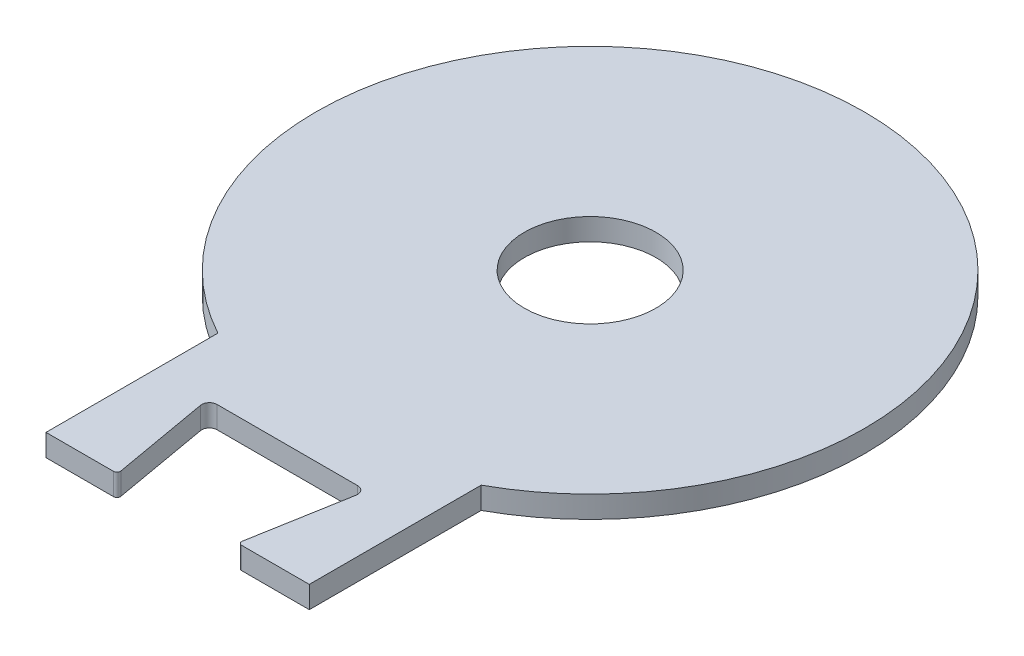
ISO-10303-21;
HEADER;
FILE_DESCRIPTION(('STEP AP214'),'2;1');
FILE_NAME('part.step','',(''),(''),'','','');
FILE_SCHEMA(('AUTOMOTIVE_DESIGN { 1 0 10303 214 1 1 1 1 }'));
ENDSEC;
DATA;
#1=APPLICATION_CONTEXT('core data for automotive mechanical design processes');
#2=APPLICATION_PROTOCOL_DEFINITION('international standard','automotive_design',2000,#1);
#3=PRODUCT_CONTEXT('',#1,'mechanical');
#4=PRODUCT('Part','Part','',(#3));
#5=PRODUCT_RELATED_PRODUCT_CATEGORY('part','',(#4));
#6=PRODUCT_DEFINITION_FORMATION('','',#4);
#7=PRODUCT_DEFINITION_CONTEXT('part definition',#1,'design');
#8=PRODUCT_DEFINITION('design','',#6,#7);
#9=PRODUCT_DEFINITION_SHAPE('','',#8);
#10=(LENGTH_UNIT() NAMED_UNIT(*) SI_UNIT(.MILLI.,.METRE.));
#11=(NAMED_UNIT(*) PLANE_ANGLE_UNIT() SI_UNIT($,.RADIAN.));
#12=(NAMED_UNIT(*) SI_UNIT($,.STERADIAN.) SOLID_ANGLE_UNIT());
#13=UNCERTAINTY_MEASURE_WITH_UNIT(LENGTH_MEASURE(1.E-05),#10,'distance_accuracy_value','');
#14=(GEOMETRIC_REPRESENTATION_CONTEXT(3) GLOBAL_UNCERTAINTY_ASSIGNED_CONTEXT((#13)) GLOBAL_UNIT_ASSIGNED_CONTEXT((#10,
#11,#12)) REPRESENTATION_CONTEXT('',''));
#15=CARTESIAN_POINT('',(0.,0.,0.));
#16=DIRECTION('',(0.,0.,1.));
#17=DIRECTION('',(1.,0.,0.));
#18=AXIS2_PLACEMENT_3D('',#15,#16,#17);
#19=CARTESIAN_POINT('',(-6.,1.,13.2915026221292));
#20=DIRECTION('',(1.,0.,0.));
#21=DIRECTION('',(0.,0.,-1.));
#22=AXIS2_PLACEMENT_3D('',#19,#20,#21);
#23=PLANE('',#22);
#24=DIRECTION('',(0.,0.,1.));
#25=VECTOR('',#24,1.);
#26=CARTESIAN_POINT('',(-6.,0.,13.2915026221292));
#27=LINE('',#26,#25);
#28=CARTESIAN_POINT('',(-6.,0.,10.9658560997307));
#29=VERTEX_POINT('',#28);
#30=CARTESIAN_POINT('',(-6.,0.,18.8));
#31=VERTEX_POINT('',#30);
#32=EDGE_CURVE('E169',#29,#31,#27,.T.);
#33=ORIENTED_EDGE('',*,*,#32,.T.);
#34=DIRECTION('',(0.,1.,0.));
#35=VECTOR('',#34,1.);
#36=CARTESIAN_POINT('',(-6.,-3.,18.8));
#37=LINE('',#36,#35);
#38=CARTESIAN_POINT('',(-6.,1.,18.8));
#39=VERTEX_POINT('',#38);
#40=EDGE_CURVE('E145',#31,#39,#37,.T.);
#41=ORIENTED_EDGE('',*,*,#40,.T.);
#42=DIRECTION('',(0.,0.,1.));
#43=VECTOR('',#42,1.);
#44=CARTESIAN_POINT('',(-6.,1.,-6.));
#45=LINE('',#44,#43);
#46=CARTESIAN_POINT('',(-6.,1.,10.9658560997307));
#47=VERTEX_POINT('',#46);
#48=EDGE_CURVE('E185',#47,#39,#45,.T.);
#49=ORIENTED_EDGE('',*,*,#48,.F.);
#50=DIRECTION('',(0.,-1.,0.));
#51=VECTOR('',#50,1.);
#52=CARTESIAN_POINT('',(-6.,1.,10.9658560997307));
#53=LINE('',#52,#51);
#54=EDGE_CURVE('E249',#29,#47,#53,.F.);
#55=ORIENTED_EDGE('',*,*,#54,.F.);
#56=EDGE_LOOP('',(#33,#41,#49,#55));
#57=FACE_BOUND('',#56,.T.);
#58=ADVANCED_FACE('F39',(#57),#23,.F.);
#59=CARTESIAN_POINT('',(6.,1.,13.2915026221292));
#60=DIRECTION('',(-1.,0.,0.));
#61=DIRECTION('',(0.,0.,1.));
#62=AXIS2_PLACEMENT_3D('',#59,#60,#61);
#63=PLANE('',#62);
#64=DIRECTION('',(0.,0.,-1.));
#65=VECTOR('',#64,1.);
#66=CARTESIAN_POINT('',(6.,1.,19.));
#67=LINE('',#66,#65);
#68=CARTESIAN_POINT('',(6.,1.,18.8));
#69=VERTEX_POINT('',#68);
#70=CARTESIAN_POINT('',(6.,1.,10.9658560997307));
#71=VERTEX_POINT('',#70);
#72=EDGE_CURVE('E152',#69,#71,#67,.T.);
#73=ORIENTED_EDGE('',*,*,#72,.F.);
#74=DIRECTION('',(0.,1.,0.));
#75=VECTOR('',#74,1.);
#76=CARTESIAN_POINT('',(6.,-3.,18.8));
#77=LINE('',#76,#75);
#78=CARTESIAN_POINT('',(6.,0.,18.8));
#79=VERTEX_POINT('',#78);
#80=EDGE_CURVE('E135',#79,#69,#77,.T.);
#81=ORIENTED_EDGE('',*,*,#80,.F.);
#82=DIRECTION('',(0.,0.,-1.));
#83=VECTOR('',#82,1.);
#84=CARTESIAN_POINT('',(6.,0.,13.2915026221292));
#85=LINE('',#84,#83);
#86=CARTESIAN_POINT('',(6.,0.,10.9658560997307));
#87=VERTEX_POINT('',#86);
#88=EDGE_CURVE('E184',#79,#87,#85,.T.);
#89=ORIENTED_EDGE('',*,*,#88,.T.);
#90=DIRECTION('',(0.,-1.,0.));
#91=VECTOR('',#90,1.);
#92=CARTESIAN_POINT('',(6.,1.,10.9658560997307));
#93=LINE('',#92,#91);
#94=EDGE_CURVE('E159',#71,#87,#93,.T.);
#95=ORIENTED_EDGE('',*,*,#94,.F.);
#96=EDGE_LOOP('',(#73,#81,#89,#95));
#97=FACE_BOUND('',#96,.T.);
#98=ADVANCED_FACE('F157',(#97),#63,.F.);
#99=CARTESIAN_POINT('',(0.,1.,0.));
#100=DIRECTION('',(0.,1.,0.));
#101=DIRECTION('',(0.,0.,1.));
#102=AXIS2_PLACEMENT_3D('',#99,#100,#101);
#103=PLANE('',#102);
#104=DIRECTION('',(-0.173648177666934,0.,0.984807753012207));
#105=VECTOR('',#104,1.);
#106=CARTESIAN_POINT('',(2.70227505957538,1.,19.));
#107=LINE('',#106,#105);
#108=CARTESIAN_POINT('',(3.54674431540572,1.,14.2107768621834));
#109=VERTEX_POINT('',#108);
#110=CARTESIAN_POINT('',(2.76858233165438,1.,18.62395277335));
#111=VERTEX_POINT('',#110);
#112=EDGE_CURVE('E161',#109,#111,#107,.T.);
#113=ORIENTED_EDGE('',*,*,#112,.T.);
#114=CARTESIAN_POINT('',(2.91630349460621,1.,18.65));
#115=DIRECTION('',(0.,1.,0.));
#116=DIRECTION('',(0.,0.,1.));
#117=AXIS2_PLACEMENT_3D('',#114,#115,#116);
#118=CIRCLE('',#117,0.15);
#119=CARTESIAN_POINT('',(2.91630349460621,1.,18.8));
#120=VERTEX_POINT('',#119);
#121=EDGE_CURVE('E154',#111,#120,#118,.T.);
#122=ORIENTED_EDGE('',*,*,#121,.T.);
#123=DIRECTION('',(-1.,0.,0.));
#124=VECTOR('',#123,1.);
#125=CARTESIAN_POINT('',(-6.,1.,18.8));
#126=LINE('',#125,#124);
#127=EDGE_CURVE('E138',#69,#120,#126,.T.);
#128=ORIENTED_EDGE('',*,*,#127,.F.);
#129=ORIENTED_EDGE('',*,*,#72,.T.);
#130=CARTESIAN_POINT('',(0.,1.,0.));
#131=DIRECTION('',(0.,1.,0.));
#132=DIRECTION('',(0.,0.,1.));
#133=AXIS2_PLACEMENT_3D('',#130,#131,#132);
#134=CIRCLE('',#133,12.5);
#135=EDGE_CURVE('E255',#71,#47,#134,.T.);
#136=ORIENTED_EDGE('',*,*,#135,.T.);
#137=ORIENTED_EDGE('',*,*,#48,.T.);
#138=CARTESIAN_POINT('',(-2.91630349460621,1.,18.8));
#139=VERTEX_POINT('',#138);
#140=EDGE_CURVE('E155',#139,#39,#126,.T.);
#141=ORIENTED_EDGE('',*,*,#140,.F.);
#142=CARTESIAN_POINT('',(-2.91630349460621,1.,18.65));
#143=DIRECTION('',(0.,1.,0.));
#144=DIRECTION('',(0.,0.,1.));
#145=AXIS2_PLACEMENT_3D('',#142,#143,#144);
#146=CIRCLE('',#145,0.15);
#147=CARTESIAN_POINT('',(-2.76858233165438,1.,18.62395277335));
#148=VERTEX_POINT('',#147);
#149=EDGE_CURVE('E213',#139,#148,#146,.T.);
#150=ORIENTED_EDGE('',*,*,#149,.T.);
#151=DIRECTION('',(-0.173648177666935,0.,-0.984807753012207));
#152=VECTOR('',#151,1.);
#153=CARTESIAN_POINT('',(-2.70227505957538,1.,19.));
#154=LINE('',#153,#152);
#155=CARTESIAN_POINT('',(-3.54674431540572,1.,14.2107768621834));
#156=VERTEX_POINT('',#155);
#157=EDGE_CURVE('E223',#148,#156,#154,.T.);
#158=ORIENTED_EDGE('',*,*,#157,.T.);
#159=CARTESIAN_POINT('',(-3.20206160185145,1.,14.15));
#160=DIRECTION('',(0.,1.,0.));
#161=DIRECTION('',(0.,0.,1.));
#162=AXIS2_PLACEMENT_3D('',#159,#160,#161);
#163=CIRCLE('',#162,0.35);
#164=CARTESIAN_POINT('',(-3.20206160185145,1.,13.8));
#165=VERTEX_POINT('',#164);
#166=EDGE_CURVE('E207',#156,#165,#163,.F.);
#167=ORIENTED_EDGE('',*,*,#166,.T.);
#168=DIRECTION('',(1.,0.,0.));
#169=VECTOR('',#168,1.);
#170=CARTESIAN_POINT('',(-3.61917535925942,1.,13.8));
#171=LINE('',#170,#169);
#172=CARTESIAN_POINT('',(3.20206160185144,1.,13.8));
#173=VERTEX_POINT('',#172);
#174=EDGE_CURVE('E165',#165,#173,#171,.T.);
#175=ORIENTED_EDGE('',*,*,#174,.T.);
#176=CARTESIAN_POINT('',(3.20206160185145,1.,14.15));
#177=DIRECTION('',(0.,1.,0.));
#178=DIRECTION('',(0.,0.,1.));
#179=AXIS2_PLACEMENT_3D('',#176,#177,#178);
#180=CIRCLE('',#179,0.35);
#181=EDGE_CURVE('E201',#173,#109,#180,.F.);
#182=ORIENTED_EDGE('',*,*,#181,.T.);
#183=EDGE_LOOP('',(#113,#122,#128,#129,#136,#137,#141,#150,#158,#167,#175,#182));
#184=FACE_BOUND('',#183,.T.);
#185=CARTESIAN_POINT('',(0.,1.,0.));
#186=DIRECTION('',(0.,1.,0.));
#187=DIRECTION('',(0.,0.,1.));
#188=AXIS2_PLACEMENT_3D('',#185,#186,#187);
#189=CIRCLE('',#188,3.);
#190=CARTESIAN_POINT('',(0.,1.,3.));
#191=VERTEX_POINT('',#190);
#192=EDGE_CURVE('E174',#191,#191,#189,.T.);
#193=ORIENTED_EDGE('',*,*,#192,.F.);
#194=EDGE_LOOP('',(#193));
#195=FACE_BOUND('',#194,.T.);
#196=ADVANCED_FACE('F149',(#184,#195),#103,.T.);
#197=CARTESIAN_POINT('',(0.,0.,0.));
#198=DIRECTION('',(0.,1.,0.));
#199=DIRECTION('',(0.,0.,1.));
#200=AXIS2_PLACEMENT_3D('',#197,#198,#199);
#201=PLANE('',#200);
#202=DIRECTION('',(-1.,0.,0.));
#203=VECTOR('',#202,1.);
#204=CARTESIAN_POINT('',(0.,0.,18.8));
#205=LINE('',#204,#203);
#206=CARTESIAN_POINT('',(2.91630349460621,0.,18.8));
#207=VERTEX_POINT('',#206);
#208=EDGE_CURVE('E141',#79,#207,#205,.T.);
#209=ORIENTED_EDGE('',*,*,#208,.T.);
#210=CARTESIAN_POINT('',(2.91630349460621,0.,18.65));
#211=DIRECTION('',(0.,1.,0.));
#212=DIRECTION('',(0.,0.,1.));
#213=AXIS2_PLACEMENT_3D('',#210,#211,#212);
#214=CIRCLE('',#213,0.15);
#215=CARTESIAN_POINT('',(2.76858233165438,0.,18.62395277335));
#216=VERTEX_POINT('',#215);
#217=EDGE_CURVE('E219',#207,#216,#214,.F.);
#218=ORIENTED_EDGE('',*,*,#217,.T.);
#219=DIRECTION('',(-0.173648177666934,0.,0.984807753012207));
#220=VECTOR('',#219,1.);
#221=CARTESIAN_POINT('',(2.70227505957538,0.,19.));
#222=LINE('',#221,#220);
#223=CARTESIAN_POINT('',(3.54674431540572,0.,14.2107768621834));
#224=VERTEX_POINT('',#223);
#225=EDGE_CURVE('E181',#224,#216,#222,.T.);
#226=ORIENTED_EDGE('',*,*,#225,.F.);
#227=CARTESIAN_POINT('',(3.20206160185145,0.,14.15));
#228=DIRECTION('',(0.,1.,0.));
#229=DIRECTION('',(0.,0.,1.));
#230=AXIS2_PLACEMENT_3D('',#227,#228,#229);
#231=CIRCLE('',#230,0.35);
#232=CARTESIAN_POINT('',(3.20206160185145,0.,13.8));
#233=VERTEX_POINT('',#232);
#234=EDGE_CURVE('E199',#224,#233,#231,.T.);
#235=ORIENTED_EDGE('',*,*,#234,.T.);
#236=DIRECTION('',(1.,0.,0.));
#237=VECTOR('',#236,1.);
#238=CARTESIAN_POINT('',(3.61917535925942,0.,13.8));
#239=LINE('',#238,#237);
#240=CARTESIAN_POINT('',(-3.20206160185144,0.,13.8));
#241=VERTEX_POINT('',#240);
#242=EDGE_CURVE('E177',#241,#233,#239,.T.);
#243=ORIENTED_EDGE('',*,*,#242,.F.);
#244=CARTESIAN_POINT('',(-3.20206160185145,0.,14.15));
#245=DIRECTION('',(0.,1.,0.));
#246=DIRECTION('',(0.,0.,1.));
#247=AXIS2_PLACEMENT_3D('',#244,#245,#246);
#248=CIRCLE('',#247,0.35);
#249=CARTESIAN_POINT('',(-3.54674431540572,0.,14.2107768621834));
#250=VERTEX_POINT('',#249);
#251=EDGE_CURVE('E203',#241,#250,#248,.T.);
#252=ORIENTED_EDGE('',*,*,#251,.T.);
#253=DIRECTION('',(-0.173648177666935,0.,-0.984807753012207));
#254=VECTOR('',#253,1.);
#255=CARTESIAN_POINT('',(-2.70227505957538,0.,19.));
#256=LINE('',#255,#254);
#257=CARTESIAN_POINT('',(-2.76858233165438,0.,18.62395277335));
#258=VERTEX_POINT('',#257);
#259=EDGE_CURVE('E173',#258,#250,#256,.T.);
#260=ORIENTED_EDGE('',*,*,#259,.F.);
#261=CARTESIAN_POINT('',(-2.91630349460621,0.,18.65));
#262=DIRECTION('',(0.,1.,0.));
#263=DIRECTION('',(0.,0.,1.));
#264=AXIS2_PLACEMENT_3D('',#261,#262,#263);
#265=CIRCLE('',#264,0.15);
#266=CARTESIAN_POINT('',(-2.91630349460621,0.,18.8));
#267=VERTEX_POINT('',#266);
#268=EDGE_CURVE('E54',#258,#267,#265,.F.);
#269=ORIENTED_EDGE('',*,*,#268,.T.);
#270=EDGE_CURVE('E260',#267,#31,#205,.T.);
#271=ORIENTED_EDGE('',*,*,#270,.T.);
#272=ORIENTED_EDGE('',*,*,#32,.F.);
#273=CARTESIAN_POINT('',(0.,0.,0.));
#274=DIRECTION('',(0.,1.,0.));
#275=DIRECTION('',(0.,0.,1.));
#276=AXIS2_PLACEMENT_3D('',#273,#274,#275);
#277=CIRCLE('',#276,12.5);
#278=EDGE_CURVE('E256',#87,#29,#277,.T.);
#279=ORIENTED_EDGE('',*,*,#278,.F.);
#280=ORIENTED_EDGE('',*,*,#88,.F.);
#281=EDGE_LOOP('',(#209,#218,#226,#235,#243,#252,#260,#269,#271,#272,#279,#280));
#282=FACE_BOUND('',#281,.T.);
#283=CARTESIAN_POINT('',(0.,0.,0.));
#284=DIRECTION('',(0.,1.,0.));
#285=DIRECTION('',(0.,0.,1.));
#286=AXIS2_PLACEMENT_3D('',#283,#284,#285);
#287=CIRCLE('',#286,3.);
#288=CARTESIAN_POINT('',(0.,0.,3.));
#289=VERTEX_POINT('',#288);
#290=EDGE_CURVE('E246',#289,#289,#287,.T.);
#291=ORIENTED_EDGE('',*,*,#290,.T.);
#292=EDGE_LOOP('',(#291));
#293=FACE_BOUND('',#292,.T.);
#294=ADVANCED_FACE('F225',(#282,#293),#201,.F.);
#295=CARTESIAN_POINT('',(-2.70227505957538,1.,19.));
#296=DIRECTION('',(-0.984807753012207,0.,0.173648177666935));
#297=DIRECTION('',(0.173648177666935,0.,0.984807753012207));
#298=AXIS2_PLACEMENT_3D('',#295,#296,#297);
#299=PLANE('',#298);
#300=ORIENTED_EDGE('',*,*,#157,.F.);
#301=DIRECTION('',(0.,-1.,0.));
#302=VECTOR('',#301,1.);
#303=CARTESIAN_POINT('',(-2.76858233165438,1.,18.62395277335));
#304=LINE('',#303,#302);
#305=EDGE_CURVE('E47',#148,#258,#304,.T.);
#306=ORIENTED_EDGE('',*,*,#305,.T.);
#307=ORIENTED_EDGE('',*,*,#259,.T.);
#308=DIRECTION('',(0.,-1.,0.));
#309=VECTOR('',#308,1.);
#310=CARTESIAN_POINT('',(-3.54674431540572,1.,14.2107768621834));
#311=LINE('',#310,#309);
#312=EDGE_CURVE('E195',#250,#156,#311,.F.);
#313=ORIENTED_EDGE('',*,*,#312,.T.);
#314=EDGE_LOOP('',(#300,#306,#307,#313));
#315=FACE_BOUND('',#314,.T.);
#316=ADVANCED_FACE('F222',(#315),#299,.F.);
#317=CARTESIAN_POINT('',(3.61917535925942,1.,13.8));
#318=DIRECTION('',(0.,0.,-1.));
#319=DIRECTION('',(-1.,0.,0.));
#320=AXIS2_PLACEMENT_3D('',#317,#318,#319);
#321=PLANE('',#320);
#322=ORIENTED_EDGE('',*,*,#242,.T.);
#323=DIRECTION('',(0.,-1.,0.));
#324=VECTOR('',#323,1.);
#325=CARTESIAN_POINT('',(3.20206160185145,1.,13.8));
#326=LINE('',#325,#324);
#327=EDGE_CURVE('E193',#233,#173,#326,.F.);
#328=ORIENTED_EDGE('',*,*,#327,.T.);
#329=ORIENTED_EDGE('',*,*,#174,.F.);
#330=DIRECTION('',(0.,-1.,0.));
#331=VECTOR('',#330,1.);
#332=CARTESIAN_POINT('',(-3.20206160185145,0.,13.8));
#333=LINE('',#332,#331);
#334=EDGE_CURVE('E189',#165,#241,#333,.T.);
#335=ORIENTED_EDGE('',*,*,#334,.T.);
#336=EDGE_LOOP('',(#322,#328,#329,#335));
#337=FACE_BOUND('',#336,.T.);
#338=ADVANCED_FACE('F237',(#337),#321,.F.);
#339=CARTESIAN_POINT('',(2.70227505957538,1.,19.));
#340=DIRECTION('',(0.984807753012207,0.,0.173648177666934));
#341=DIRECTION('',(0.173648177666934,0.,-0.984807753012207));
#342=AXIS2_PLACEMENT_3D('',#339,#340,#341);
#343=PLANE('',#342);
#344=ORIENTED_EDGE('',*,*,#225,.T.);
#345=DIRECTION('',(0.,1.,0.));
#346=VECTOR('',#345,1.);
#347=CARTESIAN_POINT('',(2.76858233165438,1.,18.62395277335));
#348=LINE('',#347,#346);
#349=EDGE_CURVE('E210',#216,#111,#348,.T.);
#350=ORIENTED_EDGE('',*,*,#349,.T.);
#351=ORIENTED_EDGE('',*,*,#112,.F.);
#352=DIRECTION('',(0.,-1.,0.));
#353=VECTOR('',#352,1.);
#354=CARTESIAN_POINT('',(3.54674431540572,0.,14.2107768621834));
#355=LINE('',#354,#353);
#356=EDGE_CURVE('E163',#109,#224,#355,.T.);
#357=ORIENTED_EDGE('',*,*,#356,.T.);
#358=EDGE_LOOP('',(#344,#350,#351,#357));
#359=FACE_BOUND('',#358,.T.);
#360=ADVANCED_FACE('F333',(#359),#343,.F.);
#361=CARTESIAN_POINT('',(0.,1.,0.));
#362=DIRECTION('',(0.,-1.,0.));
#363=DIRECTION('',(0.,0.,-1.));
#364=AXIS2_PLACEMENT_3D('',#361,#362,#363);
#365=CYLINDRICAL_SURFACE('',#364,3.);
#366=ORIENTED_EDGE('',*,*,#192,.T.);
#367=EDGE_LOOP('',(#366));
#368=FACE_BOUND('',#367,.T.);
#369=ORIENTED_EDGE('',*,*,#290,.F.);
#370=EDGE_LOOP('',(#369));
#371=FACE_BOUND('',#370,.T.);
#372=ADVANCED_FACE('F338',(#368,#371),#365,.F.);
#373=CARTESIAN_POINT('',(0.,1.,0.));
#374=DIRECTION('',(0.,-1.,0.));
#375=DIRECTION('',(0.,0.,-1.));
#376=AXIS2_PLACEMENT_3D('',#373,#374,#375);
#377=CYLINDRICAL_SURFACE('',#376,12.5);
#378=ORIENTED_EDGE('',*,*,#278,.T.);
#379=ORIENTED_EDGE('',*,*,#54,.T.);
#380=ORIENTED_EDGE('',*,*,#135,.F.);
#381=ORIENTED_EDGE('',*,*,#94,.T.);
#382=EDGE_LOOP('',(#378,#379,#380,#381));
#383=FACE_BOUND('',#382,.T.);
#384=ADVANCED_FACE('F273',(#383),#377,.T.);
#385=CARTESIAN_POINT('',(-6.,-3.,18.8));
#386=DIRECTION('',(0.,0.,-1.));
#387=DIRECTION('',(-1.,0.,0.));
#388=AXIS2_PLACEMENT_3D('',#385,#386,#387);
#389=PLANE('',#388);
#390=ORIENTED_EDGE('',*,*,#127,.T.);
#391=DIRECTION('',(0.,1.,0.));
#392=VECTOR('',#391,1.);
#393=CARTESIAN_POINT('',(2.91630349460621,-3.,18.8));
#394=LINE('',#393,#392);
#395=EDGE_CURVE('E216',#120,#207,#394,.F.);
#396=ORIENTED_EDGE('',*,*,#395,.T.);
#397=ORIENTED_EDGE('',*,*,#208,.F.);
#398=ORIENTED_EDGE('',*,*,#80,.T.);
#399=EDGE_LOOP('',(#390,#396,#397,#398));
#400=FACE_BOUND('',#399,.T.);
#401=ADVANCED_FACE('F137',(#400),#389,.F.);
#402=ORIENTED_EDGE('',*,*,#270,.F.);
#403=DIRECTION('',(0.,-1.,0.));
#404=VECTOR('',#403,1.);
#405=CARTESIAN_POINT('',(-2.91630349460621,-3.,18.8));
#406=LINE('',#405,#404);
#407=EDGE_CURVE('E11',#267,#139,#406,.F.);
#408=ORIENTED_EDGE('',*,*,#407,.T.);
#409=ORIENTED_EDGE('',*,*,#140,.T.);
#410=ORIENTED_EDGE('',*,*,#40,.F.);
#411=EDGE_LOOP('',(#402,#408,#409,#410));
#412=FACE_BOUND('',#411,.T.);
#413=ADVANCED_FACE('F276',(#412),#389,.F.);
#414=CARTESIAN_POINT('',(3.20206160185145,1.,14.15));
#415=DIRECTION('',(0.,1.,0.));
#416=DIRECTION('',(0.,0.,1.));
#417=AXIS2_PLACEMENT_3D('',#414,#415,#416);
#418=CYLINDRICAL_SURFACE('',#417,0.35);
#419=ORIENTED_EDGE('',*,*,#181,.F.);
#420=ORIENTED_EDGE('',*,*,#327,.F.);
#421=ORIENTED_EDGE('',*,*,#234,.F.);
#422=ORIENTED_EDGE('',*,*,#356,.F.);
#423=EDGE_LOOP('',(#419,#420,#421,#422));
#424=FACE_BOUND('',#423,.T.);
#425=ADVANCED_FACE('F292',(#424),#418,.F.);
#426=CARTESIAN_POINT('',(-3.20206160185145,1.,14.15));
#427=DIRECTION('',(0.,1.,0.));
#428=DIRECTION('',(0.,0.,1.));
#429=AXIS2_PLACEMENT_3D('',#426,#427,#428);
#430=CYLINDRICAL_SURFACE('',#429,0.35);
#431=ORIENTED_EDGE('',*,*,#166,.F.);
#432=ORIENTED_EDGE('',*,*,#312,.F.);
#433=ORIENTED_EDGE('',*,*,#251,.F.);
#434=ORIENTED_EDGE('',*,*,#334,.F.);
#435=EDGE_LOOP('',(#431,#432,#433,#434));
#436=FACE_BOUND('',#435,.T.);
#437=ADVANCED_FACE('F232',(#436),#430,.F.);
#438=CARTESIAN_POINT('',(2.91630349460621,1.,18.65));
#439=DIRECTION('',(0.,1.,0.));
#440=DIRECTION('',(0.,0.,1.));
#441=AXIS2_PLACEMENT_3D('',#438,#439,#440);
#442=CYLINDRICAL_SURFACE('',#441,0.15);
#443=ORIENTED_EDGE('',*,*,#217,.F.);
#444=ORIENTED_EDGE('',*,*,#395,.F.);
#445=ORIENTED_EDGE('',*,*,#121,.F.);
#446=ORIENTED_EDGE('',*,*,#349,.F.);
#447=EDGE_LOOP('',(#443,#444,#445,#446));
#448=FACE_BOUND('',#447,.T.);
#449=ADVANCED_FACE('F278',(#448),#442,.T.);
#450=CARTESIAN_POINT('',(-2.91630349460621,1.,18.65));
#451=DIRECTION('',(0.,-1.,0.));
#452=DIRECTION('',(0.,0.,-1.));
#453=AXIS2_PLACEMENT_3D('',#450,#451,#452);
#454=CYLINDRICAL_SURFACE('',#453,0.15);
#455=ORIENTED_EDGE('',*,*,#149,.F.);
#456=ORIENTED_EDGE('',*,*,#407,.F.);
#457=ORIENTED_EDGE('',*,*,#268,.F.);
#458=ORIENTED_EDGE('',*,*,#305,.F.);
#459=EDGE_LOOP('',(#455,#456,#457,#458));
#460=FACE_BOUND('',#459,.T.);
#461=ADVANCED_FACE('F41',(#460),#454,.T.);
#462=CLOSED_SHELL('',(#58,#98,#196,#294,#316,#338,#360,#372,#384,#401,#413,#425,#437,#449,#461));
#463=MANIFOLD_SOLID_BREP('B2',#462);
#464=ADVANCED_BREP_SHAPE_REPRESENTATION('',(#18,#463),#14);
#465=SHAPE_DEFINITION_REPRESENTATION(#9,#464);
ENDSEC;
END-ISO-10303-21;
